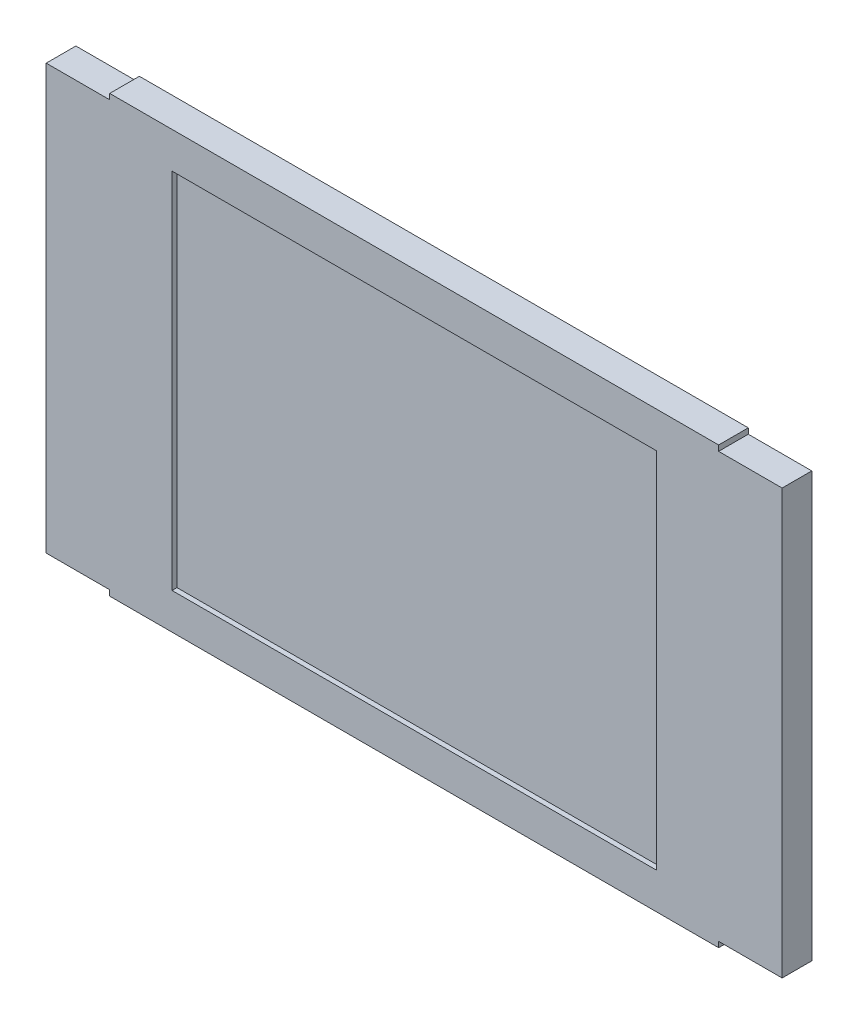
ISO-10303-21;
HEADER;
FILE_DESCRIPTION(('STEP AP214'),'2;1');
FILE_NAME('part.step','',(''),(''),'','','');
FILE_SCHEMA(('AUTOMOTIVE_DESIGN { 1 0 10303 214 1 1 1 1 }'));
ENDSEC;
DATA;
#1=APPLICATION_CONTEXT('core data for automotive mechanical design processes');
#2=APPLICATION_PROTOCOL_DEFINITION('international standard','automotive_design',2000,#1);
#3=PRODUCT_CONTEXT('',#1,'mechanical');
#4=PRODUCT('Part','Part','',(#3));
#5=PRODUCT_RELATED_PRODUCT_CATEGORY('part','',(#4));
#6=PRODUCT_DEFINITION_FORMATION('','',#4);
#7=PRODUCT_DEFINITION_CONTEXT('part definition',#1,'design');
#8=PRODUCT_DEFINITION('design','',#6,#7);
#9=PRODUCT_DEFINITION_SHAPE('','',#8);
#10=(LENGTH_UNIT() NAMED_UNIT(*) SI_UNIT(.MILLI.,.METRE.));
#11=(NAMED_UNIT(*) PLANE_ANGLE_UNIT() SI_UNIT($,.RADIAN.));
#12=(NAMED_UNIT(*) SI_UNIT($,.STERADIAN.) SOLID_ANGLE_UNIT());
#13=UNCERTAINTY_MEASURE_WITH_UNIT(LENGTH_MEASURE(1.E-05),#10,'distance_accuracy_value','');
#14=(GEOMETRIC_REPRESENTATION_CONTEXT(3) GLOBAL_UNCERTAINTY_ASSIGNED_CONTEXT((#13)) GLOBAL_UNIT_ASSIGNED_CONTEXT((#10,
#11,#12)) REPRESENTATION_CONTEXT('',''));
#15=CARTESIAN_POINT('',(0.,0.,0.));
#16=DIRECTION('',(0.,0.,1.));
#17=DIRECTION('',(1.,0.,0.));
#18=AXIS2_PLACEMENT_3D('',#15,#16,#17);
#19=CARTESIAN_POINT('',(-37.2,21.45,3.));
#20=DIRECTION('',(0.,-1.,0.));
#21=DIRECTION('',(0.,0.,-1.));
#22=AXIS2_PLACEMENT_3D('',#19,#20,#21);
#23=PLANE('',#22);
#24=DIRECTION('',(-1.,0.,0.));
#25=VECTOR('',#24,1.);
#26=CARTESIAN_POINT('',(-37.2,21.45,0.));
#27=LINE('',#26,#25);
#28=CARTESIAN_POINT('',(37.2,21.45,0.));
#29=VERTEX_POINT('',#28);
#30=CARTESIAN_POINT('',(30.78,21.45,0.));
#31=VERTEX_POINT('',#30);
#32=EDGE_CURVE('E250',#29,#31,#27,.T.);
#33=ORIENTED_EDGE('',*,*,#32,.T.);
#34=DIRECTION('',(0.,0.,1.));
#35=VECTOR('',#34,1.);
#36=CARTESIAN_POINT('',(30.78,21.45,3.));
#37=LINE('',#36,#35);
#38=CARTESIAN_POINT('',(30.78,21.45,3.));
#39=VERTEX_POINT('',#38);
#40=EDGE_CURVE('E228',#31,#39,#37,.T.);
#41=ORIENTED_EDGE('',*,*,#40,.T.);
#42=DIRECTION('',(-1.,0.,0.));
#43=VECTOR('',#42,1.);
#44=CARTESIAN_POINT('',(-37.2,21.45,3.));
#45=LINE('',#44,#43);
#46=CARTESIAN_POINT('',(37.2,21.45,3.));
#47=VERTEX_POINT('',#46);
#48=EDGE_CURVE('E237',#47,#39,#45,.T.);
#49=ORIENTED_EDGE('',*,*,#48,.F.);
#50=DIRECTION('',(0.,0.,-1.));
#51=VECTOR('',#50,1.);
#52=CARTESIAN_POINT('',(37.2,21.45,3.));
#53=LINE('',#52,#51);
#54=EDGE_CURVE('E11',#47,#29,#53,.T.);
#55=ORIENTED_EDGE('',*,*,#54,.T.);
#56=EDGE_LOOP('',(#33,#41,#49,#55));
#57=FACE_BOUND('',#56,.T.);
#58=ADVANCED_FACE('F35',(#57),#23,.F.);
#59=CARTESIAN_POINT('',(-37.2,-21.45,3.));
#60=DIRECTION('',(0.,1.,0.));
#61=DIRECTION('',(0.,0.,1.));
#62=AXIS2_PLACEMENT_3D('',#59,#60,#61);
#63=PLANE('',#62);
#64=DIRECTION('',(1.,0.,0.));
#65=VECTOR('',#64,1.);
#66=CARTESIAN_POINT('',(-37.2,-21.45,3.));
#67=LINE('',#66,#65);
#68=CARTESIAN_POINT('',(30.78,-21.45,3.));
#69=VERTEX_POINT('',#68);
#70=CARTESIAN_POINT('',(37.2,-21.45,3.));
#71=VERTEX_POINT('',#70);
#72=EDGE_CURVE('E242',#69,#71,#67,.T.);
#73=ORIENTED_EDGE('',*,*,#72,.F.);
#74=DIRECTION('',(0.,0.,-1.));
#75=VECTOR('',#74,1.);
#76=CARTESIAN_POINT('',(30.78,-21.45,3.));
#77=LINE('',#76,#75);
#78=CARTESIAN_POINT('',(30.78,-21.45,0.));
#79=VERTEX_POINT('',#78);
#80=EDGE_CURVE('E225',#69,#79,#77,.T.);
#81=ORIENTED_EDGE('',*,*,#80,.T.);
#82=DIRECTION('',(1.,0.,0.));
#83=VECTOR('',#82,1.);
#84=CARTESIAN_POINT('',(-37.2,-21.45,0.));
#85=LINE('',#84,#83);
#86=CARTESIAN_POINT('',(37.2,-21.45,0.));
#87=VERTEX_POINT('',#86);
#88=EDGE_CURVE('E255',#79,#87,#85,.T.);
#89=ORIENTED_EDGE('',*,*,#88,.T.);
#90=DIRECTION('',(0.,0.,-1.));
#91=VECTOR('',#90,1.);
#92=CARTESIAN_POINT('',(37.2,-21.45,3.));
#93=LINE('',#92,#91);
#94=EDGE_CURVE('E246',#71,#87,#93,.T.);
#95=ORIENTED_EDGE('',*,*,#94,.F.);
#96=EDGE_LOOP('',(#73,#81,#89,#95));
#97=FACE_BOUND('',#96,.T.);
#98=ADVANCED_FACE('F305',(#97),#63,.F.);
#99=CARTESIAN_POINT('',(37.2,21.45,3.));
#100=DIRECTION('',(-1.,0.,0.));
#101=DIRECTION('',(0.,0.,1.));
#102=AXIS2_PLACEMENT_3D('',#99,#100,#101);
#103=PLANE('',#102);
#104=DIRECTION('',(0.,1.,0.));
#105=VECTOR('',#104,1.);
#106=CARTESIAN_POINT('',(37.2,21.45,0.));
#107=LINE('',#106,#105);
#108=EDGE_CURVE('E231',#87,#29,#107,.T.);
#109=ORIENTED_EDGE('',*,*,#108,.T.);
#110=ORIENTED_EDGE('',*,*,#54,.F.);
#111=DIRECTION('',(0.,1.,0.));
#112=VECTOR('',#111,1.);
#113=CARTESIAN_POINT('',(37.2,21.45,3.));
#114=LINE('',#113,#112);
#115=EDGE_CURVE('E232',#71,#47,#114,.T.);
#116=ORIENTED_EDGE('',*,*,#115,.F.);
#117=ORIENTED_EDGE('',*,*,#94,.T.);
#118=EDGE_LOOP('',(#109,#110,#116,#117));
#119=FACE_BOUND('',#118,.T.);
#120=ADVANCED_FACE('F37',(#119),#103,.F.);
#121=CARTESIAN_POINT('',(-30.78,21.45,3.));
#122=VERTEX_POINT('',#121);
#123=CARTESIAN_POINT('',(-37.2,21.45,3.));
#124=VERTEX_POINT('',#123);
#125=EDGE_CURVE('E235',#122,#124,#45,.T.);
#126=ORIENTED_EDGE('',*,*,#125,.F.);
#127=DIRECTION('',(0.,0.,-1.));
#128=VECTOR('',#127,1.);
#129=CARTESIAN_POINT('',(-30.78,21.45,3.));
#130=LINE('',#129,#128);
#131=CARTESIAN_POINT('',(-30.78,21.45,0.));
#132=VERTEX_POINT('',#131);
#133=EDGE_CURVE('E222',#122,#132,#130,.T.);
#134=ORIENTED_EDGE('',*,*,#133,.T.);
#135=CARTESIAN_POINT('',(-37.2,21.45,0.));
#136=VERTEX_POINT('',#135);
#137=EDGE_CURVE('E249',#132,#136,#27,.T.);
#138=ORIENTED_EDGE('',*,*,#137,.T.);
#139=DIRECTION('',(0.,0.,-1.));
#140=VECTOR('',#139,1.);
#141=CARTESIAN_POINT('',(-37.2,21.45,3.));
#142=LINE('',#141,#140);
#143=EDGE_CURVE('E43',#124,#136,#142,.T.);
#144=ORIENTED_EDGE('',*,*,#143,.F.);
#145=EDGE_LOOP('',(#126,#134,#138,#144));
#146=FACE_BOUND('',#145,.T.);
#147=ADVANCED_FACE('F284',(#146),#23,.F.);
#148=CARTESIAN_POINT('',(-37.2,21.45,3.));
#149=DIRECTION('',(1.,0.,0.));
#150=DIRECTION('',(0.,1.,0.));
#151=AXIS2_PLACEMENT_3D('',#148,#149,#150);
#152=PLANE('',#151);
#153=DIRECTION('',(0.,-1.,0.));
#154=VECTOR('',#153,1.);
#155=CARTESIAN_POINT('',(-37.2,21.45,0.));
#156=LINE('',#155,#154);
#157=CARTESIAN_POINT('',(-37.2,-21.45,0.));
#158=VERTEX_POINT('',#157);
#159=EDGE_CURVE('E253',#136,#158,#156,.T.);
#160=ORIENTED_EDGE('',*,*,#159,.T.);
#161=DIRECTION('',(0.,0.,-1.));
#162=VECTOR('',#161,1.);
#163=CARTESIAN_POINT('',(-37.2,-21.45,3.));
#164=LINE('',#163,#162);
#165=CARTESIAN_POINT('',(-37.2,-21.45,3.));
#166=VERTEX_POINT('',#165);
#167=EDGE_CURVE('E260',#166,#158,#164,.T.);
#168=ORIENTED_EDGE('',*,*,#167,.F.);
#169=DIRECTION('',(0.,-1.,0.));
#170=VECTOR('',#169,1.);
#171=CARTESIAN_POINT('',(-37.2,21.45,3.));
#172=LINE('',#171,#170);
#173=EDGE_CURVE('E240',#124,#166,#172,.T.);
#174=ORIENTED_EDGE('',*,*,#173,.F.);
#175=ORIENTED_EDGE('',*,*,#143,.T.);
#176=EDGE_LOOP('',(#160,#168,#174,#175));
#177=FACE_BOUND('',#176,.T.);
#178=ADVANCED_FACE('F267',(#177),#152,.F.);
#179=CARTESIAN_POINT('',(-30.78,-21.45,0.));
#180=VERTEX_POINT('',#179);
#181=EDGE_CURVE('E236',#158,#180,#85,.T.);
#182=ORIENTED_EDGE('',*,*,#181,.T.);
#183=DIRECTION('',(0.,0.,1.));
#184=VECTOR('',#183,1.);
#185=CARTESIAN_POINT('',(-30.78,-21.45,3.));
#186=LINE('',#185,#184);
#187=CARTESIAN_POINT('',(-30.78,-21.45,3.));
#188=VERTEX_POINT('',#187);
#189=EDGE_CURVE('E212',#180,#188,#186,.T.);
#190=ORIENTED_EDGE('',*,*,#189,.T.);
#191=EDGE_CURVE('E243',#166,#188,#67,.T.);
#192=ORIENTED_EDGE('',*,*,#191,.F.);
#193=ORIENTED_EDGE('',*,*,#167,.T.);
#194=EDGE_LOOP('',(#182,#190,#192,#193));
#195=FACE_BOUND('',#194,.T.);
#196=ADVANCED_FACE('F279',(#195),#63,.F.);
#197=CARTESIAN_POINT('',(0.,0.,3.));
#198=DIRECTION('',(0.,0.,1.));
#199=DIRECTION('',(1.,0.,0.));
#200=AXIS2_PLACEMENT_3D('',#197,#198,#199);
#201=PLANE('',#200);
#202=DIRECTION('',(0.,1.,0.));
#203=VECTOR('',#202,1.);
#204=CARTESIAN_POINT('',(24.48,18.36,3.));
#205=LINE('',#204,#203);
#206=CARTESIAN_POINT('',(24.48,-18.36,3.));
#207=VERTEX_POINT('',#206);
#208=CARTESIAN_POINT('',(24.48,18.36,3.));
#209=VERTEX_POINT('',#208);
#210=EDGE_CURVE('E50',#207,#209,#205,.T.);
#211=ORIENTED_EDGE('',*,*,#210,.F.);
#212=DIRECTION('',(1.,0.,0.));
#213=VECTOR('',#212,1.);
#214=CARTESIAN_POINT('',(-24.48,-18.36,3.));
#215=LINE('',#214,#213);
#216=CARTESIAN_POINT('',(-24.48,-18.36,3.));
#217=VERTEX_POINT('',#216);
#218=EDGE_CURVE('E169',#217,#207,#215,.T.);
#219=ORIENTED_EDGE('',*,*,#218,.F.);
#220=DIRECTION('',(0.,-1.,0.));
#221=VECTOR('',#220,1.);
#222=CARTESIAN_POINT('',(-24.48,18.36,3.));
#223=LINE('',#222,#221);
#224=CARTESIAN_POINT('',(-24.48,18.36,3.));
#225=VERTEX_POINT('',#224);
#226=EDGE_CURVE('E172',#225,#217,#223,.T.);
#227=ORIENTED_EDGE('',*,*,#226,.F.);
#228=DIRECTION('',(-1.,0.,0.));
#229=VECTOR('',#228,1.);
#230=CARTESIAN_POINT('',(-24.48,18.36,3.));
#231=LINE('',#230,#229);
#232=EDGE_CURVE('E178',#209,#225,#231,.T.);
#233=ORIENTED_EDGE('',*,*,#232,.F.);
#234=EDGE_LOOP('',(#211,#219,#227,#233));
#235=FACE_BOUND('',#234,.T.);
#236=ORIENTED_EDGE('',*,*,#191,.T.);
#237=DIRECTION('',(0.,-1.,0.));
#238=VECTOR('',#237,1.);
#239=CARTESIAN_POINT('',(-30.78,22.01,3.));
#240=LINE('',#239,#238);
#241=CARTESIAN_POINT('',(-30.78,-22.01,3.));
#242=VERTEX_POINT('',#241);
#243=EDGE_CURVE('E205',#188,#242,#240,.T.);
#244=ORIENTED_EDGE('',*,*,#243,.T.);
#245=DIRECTION('',(1.,0.,0.));
#246=VECTOR('',#245,1.);
#247=CARTESIAN_POINT('',(-30.78,-22.01,3.));
#248=LINE('',#247,#246);
#249=CARTESIAN_POINT('',(30.78,-22.01,3.));
#250=VERTEX_POINT('',#249);
#251=EDGE_CURVE('E208',#242,#250,#248,.T.);
#252=ORIENTED_EDGE('',*,*,#251,.T.);
#253=DIRECTION('',(0.,1.,0.));
#254=VECTOR('',#253,1.);
#255=CARTESIAN_POINT('',(30.78,22.01,3.));
#256=LINE('',#255,#254);
#257=EDGE_CURVE('E58',#250,#69,#256,.T.);
#258=ORIENTED_EDGE('',*,*,#257,.T.);
#259=ORIENTED_EDGE('',*,*,#72,.T.);
#260=ORIENTED_EDGE('',*,*,#115,.T.);
#261=ORIENTED_EDGE('',*,*,#48,.T.);
#262=CARTESIAN_POINT('',(30.78,22.01,3.));
#263=VERTEX_POINT('',#262);
#264=EDGE_CURVE('E184',#39,#263,#256,.T.);
#265=ORIENTED_EDGE('',*,*,#264,.T.);
#266=DIRECTION('',(-1.,0.,0.));
#267=VECTOR('',#266,1.);
#268=CARTESIAN_POINT('',(-30.78,22.01,3.));
#269=LINE('',#268,#267);
#270=CARTESIAN_POINT('',(-30.78,22.01,3.));
#271=VERTEX_POINT('',#270);
#272=EDGE_CURVE('E202',#263,#271,#269,.T.);
#273=ORIENTED_EDGE('',*,*,#272,.T.);
#274=EDGE_CURVE('E206',#271,#122,#240,.T.);
#275=ORIENTED_EDGE('',*,*,#274,.T.);
#276=ORIENTED_EDGE('',*,*,#125,.T.);
#277=ORIENTED_EDGE('',*,*,#173,.T.);
#278=EDGE_LOOP('',(#236,#244,#252,#258,#259,#260,#261,#265,#273,#275,#276,#277));
#279=FACE_BOUND('',#278,.T.);
#280=ADVANCED_FACE('F281',(#235,#279),#201,.T.);
#281=CARTESIAN_POINT('',(0.,0.,0.));
#282=DIRECTION('',(0.,0.,1.));
#283=DIRECTION('',(1.,0.,0.));
#284=AXIS2_PLACEMENT_3D('',#281,#282,#283);
#285=PLANE('',#284);
#286=ORIENTED_EDGE('',*,*,#137,.F.);
#287=DIRECTION('',(0.,-1.,0.));
#288=VECTOR('',#287,1.);
#289=CARTESIAN_POINT('',(-30.78,22.01,0.));
#290=LINE('',#289,#288);
#291=CARTESIAN_POINT('',(-30.78,22.01,0.));
#292=VERTEX_POINT('',#291);
#293=EDGE_CURVE('E195',#292,#132,#290,.T.);
#294=ORIENTED_EDGE('',*,*,#293,.F.);
#295=DIRECTION('',(-1.,0.,0.));
#296=VECTOR('',#295,1.);
#297=CARTESIAN_POINT('',(-30.78,22.01,0.));
#298=LINE('',#297,#296);
#299=CARTESIAN_POINT('',(30.78,22.01,0.));
#300=VERTEX_POINT('',#299);
#301=EDGE_CURVE('E190',#300,#292,#298,.T.);
#302=ORIENTED_EDGE('',*,*,#301,.F.);
#303=DIRECTION('',(0.,1.,0.));
#304=VECTOR('',#303,1.);
#305=CARTESIAN_POINT('',(30.78,22.01,0.));
#306=LINE('',#305,#304);
#307=EDGE_CURVE('E191',#31,#300,#306,.T.);
#308=ORIENTED_EDGE('',*,*,#307,.F.);
#309=ORIENTED_EDGE('',*,*,#32,.F.);
#310=ORIENTED_EDGE('',*,*,#108,.F.);
#311=ORIENTED_EDGE('',*,*,#88,.F.);
#312=CARTESIAN_POINT('',(30.78,-22.01,0.));
#313=VERTEX_POINT('',#312);
#314=EDGE_CURVE('E188',#313,#79,#306,.T.);
#315=ORIENTED_EDGE('',*,*,#314,.F.);
#316=DIRECTION('',(1.,0.,0.));
#317=VECTOR('',#316,1.);
#318=CARTESIAN_POINT('',(-30.78,-22.01,0.));
#319=LINE('',#318,#317);
#320=CARTESIAN_POINT('',(-30.78,-22.01,0.));
#321=VERTEX_POINT('',#320);
#322=EDGE_CURVE('E197',#321,#313,#319,.T.);
#323=ORIENTED_EDGE('',*,*,#322,.F.);
#324=EDGE_CURVE('E194',#180,#321,#290,.T.);
#325=ORIENTED_EDGE('',*,*,#324,.F.);
#326=ORIENTED_EDGE('',*,*,#181,.F.);
#327=ORIENTED_EDGE('',*,*,#159,.F.);
#328=EDGE_LOOP('',(#286,#294,#302,#308,#309,#310,#311,#315,#323,#325,#326,#327));
#329=FACE_BOUND('',#328,.T.);
#330=ADVANCED_FACE('F274',(#329),#285,.F.);
#331=CARTESIAN_POINT('',(-30.78,-22.01,0.));
#332=DIRECTION('',(0.,-1.,0.));
#333=DIRECTION('',(0.,0.,-1.));
#334=AXIS2_PLACEMENT_3D('',#331,#332,#333);
#335=PLANE('',#334);
#336=ORIENTED_EDGE('',*,*,#251,.F.);
#337=DIRECTION('',(0.,0.,1.));
#338=VECTOR('',#337,1.);
#339=CARTESIAN_POINT('',(-30.78,-22.01,0.));
#340=LINE('',#339,#338);
#341=EDGE_CURVE('E213',#321,#242,#340,.T.);
#342=ORIENTED_EDGE('',*,*,#341,.F.);
#343=ORIENTED_EDGE('',*,*,#322,.T.);
#344=DIRECTION('',(0.,0.,1.));
#345=VECTOR('',#344,1.);
#346=CARTESIAN_POINT('',(30.78,-22.01,0.));
#347=LINE('',#346,#345);
#348=EDGE_CURVE('E210',#313,#250,#347,.T.);
#349=ORIENTED_EDGE('',*,*,#348,.T.);
#350=EDGE_LOOP('',(#336,#342,#343,#349));
#351=FACE_BOUND('',#350,.T.);
#352=ADVANCED_FACE('F310',(#351),#335,.T.);
#353=CARTESIAN_POINT('',(-30.78,22.01,0.));
#354=DIRECTION('',(-1.,0.,0.));
#355=DIRECTION('',(0.,-1.,0.));
#356=AXIS2_PLACEMENT_3D('',#353,#354,#355);
#357=PLANE('',#356);
#358=ORIENTED_EDGE('',*,*,#189,.F.);
#359=ORIENTED_EDGE('',*,*,#324,.T.);
#360=ORIENTED_EDGE('',*,*,#341,.T.);
#361=ORIENTED_EDGE('',*,*,#243,.F.);
#362=EDGE_LOOP('',(#358,#359,#360,#361));
#363=FACE_BOUND('',#362,.T.);
#364=ADVANCED_FACE('F313',(#363),#357,.T.);
#365=CARTESIAN_POINT('',(30.78,22.01,0.));
#366=DIRECTION('',(1.,0.,0.));
#367=DIRECTION('',(0.,1.,0.));
#368=AXIS2_PLACEMENT_3D('',#365,#366,#367);
#369=PLANE('',#368);
#370=ORIENTED_EDGE('',*,*,#80,.F.);
#371=ORIENTED_EDGE('',*,*,#257,.F.);
#372=ORIENTED_EDGE('',*,*,#348,.F.);
#373=ORIENTED_EDGE('',*,*,#314,.T.);
#374=EDGE_LOOP('',(#370,#371,#372,#373));
#375=FACE_BOUND('',#374,.T.);
#376=ADVANCED_FACE('F307',(#375),#369,.T.);
#377=ORIENTED_EDGE('',*,*,#40,.F.);
#378=ORIENTED_EDGE('',*,*,#307,.T.);
#379=DIRECTION('',(0.,0.,1.));
#380=VECTOR('',#379,1.);
#381=CARTESIAN_POINT('',(30.78,22.01,0.));
#382=LINE('',#381,#380);
#383=EDGE_CURVE('E200',#300,#263,#382,.T.);
#384=ORIENTED_EDGE('',*,*,#383,.T.);
#385=ORIENTED_EDGE('',*,*,#264,.F.);
#386=EDGE_LOOP('',(#377,#378,#384,#385));
#387=FACE_BOUND('',#386,.T.);
#388=ADVANCED_FACE('F294',(#387),#369,.T.);
#389=ORIENTED_EDGE('',*,*,#133,.F.);
#390=ORIENTED_EDGE('',*,*,#274,.F.);
#391=DIRECTION('',(0.,0.,1.));
#392=VECTOR('',#391,1.);
#393=CARTESIAN_POINT('',(-30.78,22.01,0.));
#394=LINE('',#393,#392);
#395=EDGE_CURVE('E216',#292,#271,#394,.T.);
#396=ORIENTED_EDGE('',*,*,#395,.F.);
#397=ORIENTED_EDGE('',*,*,#293,.T.);
#398=EDGE_LOOP('',(#389,#390,#396,#397));
#399=FACE_BOUND('',#398,.T.);
#400=ADVANCED_FACE('F286',(#399),#357,.T.);
#401=CARTESIAN_POINT('',(-30.78,22.01,0.));
#402=DIRECTION('',(0.,1.,0.));
#403=DIRECTION('',(0.,0.,1.));
#404=AXIS2_PLACEMENT_3D('',#401,#402,#403);
#405=PLANE('',#404);
#406=ORIENTED_EDGE('',*,*,#272,.F.);
#407=ORIENTED_EDGE('',*,*,#383,.F.);
#408=ORIENTED_EDGE('',*,*,#301,.T.);
#409=ORIENTED_EDGE('',*,*,#395,.T.);
#410=EDGE_LOOP('',(#406,#407,#408,#409));
#411=FACE_BOUND('',#410,.T.);
#412=ADVANCED_FACE('F292',(#411),#405,.T.);
#413=CARTESIAN_POINT('',(24.48,18.36,2.5));
#414=DIRECTION('',(1.,0.,0.));
#415=DIRECTION('',(0.,0.,-1.));
#416=AXIS2_PLACEMENT_3D('',#413,#414,#415);
#417=PLANE('',#416);
#418=ORIENTED_EDGE('',*,*,#210,.T.);
#419=DIRECTION('',(0.,0.,1.));
#420=VECTOR('',#419,1.);
#421=CARTESIAN_POINT('',(24.48,18.36,2.5));
#422=LINE('',#421,#420);
#423=CARTESIAN_POINT('',(24.48,18.36,2.5));
#424=VERTEX_POINT('',#423);
#425=EDGE_CURVE('E147',#424,#209,#422,.T.);
#426=ORIENTED_EDGE('',*,*,#425,.F.);
#427=DIRECTION('',(0.,1.,0.));
#428=VECTOR('',#427,1.);
#429=CARTESIAN_POINT('',(24.48,18.36,2.5));
#430=LINE('',#429,#428);
#431=CARTESIAN_POINT('',(24.48,-18.36,2.5));
#432=VERTEX_POINT('',#431);
#433=EDGE_CURVE('E151',#432,#424,#430,.T.);
#434=ORIENTED_EDGE('',*,*,#433,.F.);
#435=DIRECTION('',(0.,0.,1.));
#436=VECTOR('',#435,1.);
#437=CARTESIAN_POINT('',(24.48,-18.36,2.5));
#438=LINE('',#437,#436);
#439=EDGE_CURVE('E182',#432,#207,#438,.T.);
#440=ORIENTED_EDGE('',*,*,#439,.T.);
#441=EDGE_LOOP('',(#418,#426,#434,#440));
#442=FACE_BOUND('',#441,.T.);
#443=ADVANCED_FACE('F149',(#442),#417,.F.);
#444=CARTESIAN_POINT('',(-24.48,-18.36,2.5));
#445=DIRECTION('',(0.,-1.,0.));
#446=DIRECTION('',(0.,0.,-1.));
#447=AXIS2_PLACEMENT_3D('',#444,#445,#446);
#448=PLANE('',#447);
#449=ORIENTED_EDGE('',*,*,#218,.T.);
#450=ORIENTED_EDGE('',*,*,#439,.F.);
#451=DIRECTION('',(1.,0.,0.));
#452=VECTOR('',#451,1.);
#453=CARTESIAN_POINT('',(-24.48,-18.36,2.5));
#454=LINE('',#453,#452);
#455=CARTESIAN_POINT('',(-24.48,-18.36,2.5));
#456=VERTEX_POINT('',#455);
#457=EDGE_CURVE('E157',#456,#432,#454,.T.);
#458=ORIENTED_EDGE('',*,*,#457,.F.);
#459=DIRECTION('',(0.,0.,1.));
#460=VECTOR('',#459,1.);
#461=CARTESIAN_POINT('',(-24.48,-18.36,2.5));
#462=LINE('',#461,#460);
#463=EDGE_CURVE('E185',#456,#217,#462,.T.);
#464=ORIENTED_EDGE('',*,*,#463,.T.);
#465=EDGE_LOOP('',(#449,#450,#458,#464));
#466=FACE_BOUND('',#465,.T.);
#467=ADVANCED_FACE('F421',(#466),#448,.F.);
#468=CARTESIAN_POINT('',(-24.48,18.36,2.5));
#469=DIRECTION('',(-1.,0.,0.));
#470=DIRECTION('',(0.,0.,1.));
#471=AXIS2_PLACEMENT_3D('',#468,#469,#470);
#472=PLANE('',#471);
#473=ORIENTED_EDGE('',*,*,#226,.T.);
#474=ORIENTED_EDGE('',*,*,#463,.F.);
#475=DIRECTION('',(0.,-1.,0.));
#476=VECTOR('',#475,1.);
#477=CARTESIAN_POINT('',(-24.48,18.36,2.5));
#478=LINE('',#477,#476);
#479=CARTESIAN_POINT('',(-24.48,18.36,2.5));
#480=VERTEX_POINT('',#479);
#481=EDGE_CURVE('E165',#480,#456,#478,.T.);
#482=ORIENTED_EDGE('',*,*,#481,.F.);
#483=DIRECTION('',(0.,0.,1.));
#484=VECTOR('',#483,1.);
#485=CARTESIAN_POINT('',(-24.48,18.36,2.5));
#486=LINE('',#485,#484);
#487=EDGE_CURVE('E156',#480,#225,#486,.T.);
#488=ORIENTED_EDGE('',*,*,#487,.T.);
#489=EDGE_LOOP('',(#473,#474,#482,#488));
#490=FACE_BOUND('',#489,.T.);
#491=ADVANCED_FACE('F427',(#490),#472,.F.);
#492=CARTESIAN_POINT('',(-24.48,18.36,2.5));
#493=DIRECTION('',(0.,1.,0.));
#494=DIRECTION('',(0.,0.,1.));
#495=AXIS2_PLACEMENT_3D('',#492,#493,#494);
#496=PLANE('',#495);
#497=ORIENTED_EDGE('',*,*,#232,.T.);
#498=ORIENTED_EDGE('',*,*,#487,.F.);
#499=DIRECTION('',(-1.,0.,0.));
#500=VECTOR('',#499,1.);
#501=CARTESIAN_POINT('',(-24.48,18.36,2.5));
#502=LINE('',#501,#500);
#503=EDGE_CURVE('E160',#424,#480,#502,.T.);
#504=ORIENTED_EDGE('',*,*,#503,.F.);
#505=ORIENTED_EDGE('',*,*,#425,.T.);
#506=EDGE_LOOP('',(#497,#498,#504,#505));
#507=FACE_BOUND('',#506,.T.);
#508=ADVANCED_FACE('F161',(#507),#496,.F.);
#509=CARTESIAN_POINT('',(0.,0.,2.5));
#510=DIRECTION('',(0.,0.,1.));
#511=DIRECTION('',(1.,0.,0.));
#512=AXIS2_PLACEMENT_3D('',#509,#510,#511);
#513=PLANE('',#512);
#514=ORIENTED_EDGE('',*,*,#433,.T.);
#515=ORIENTED_EDGE('',*,*,#503,.T.);
#516=ORIENTED_EDGE('',*,*,#481,.T.);
#517=ORIENTED_EDGE('',*,*,#457,.T.);
#518=EDGE_LOOP('',(#514,#515,#516,#517));
#519=FACE_BOUND('',#518,.T.);
#520=ADVANCED_FACE('F167',(#519),#513,.T.);
#521=CLOSED_SHELL('',(#58,#98,#120,#147,#178,#196,#280,#330,#352,#364,#376,#388,#400,#412,#443,
#467,#491,#508,#520));
#522=MANIFOLD_SOLID_BREP('B2',#521);
#523=ADVANCED_BREP_SHAPE_REPRESENTATION('',(#18,#522),#14);
#524=SHAPE_DEFINITION_REPRESENTATION(#9,#523);
ENDSEC;
END-ISO-10303-21;
